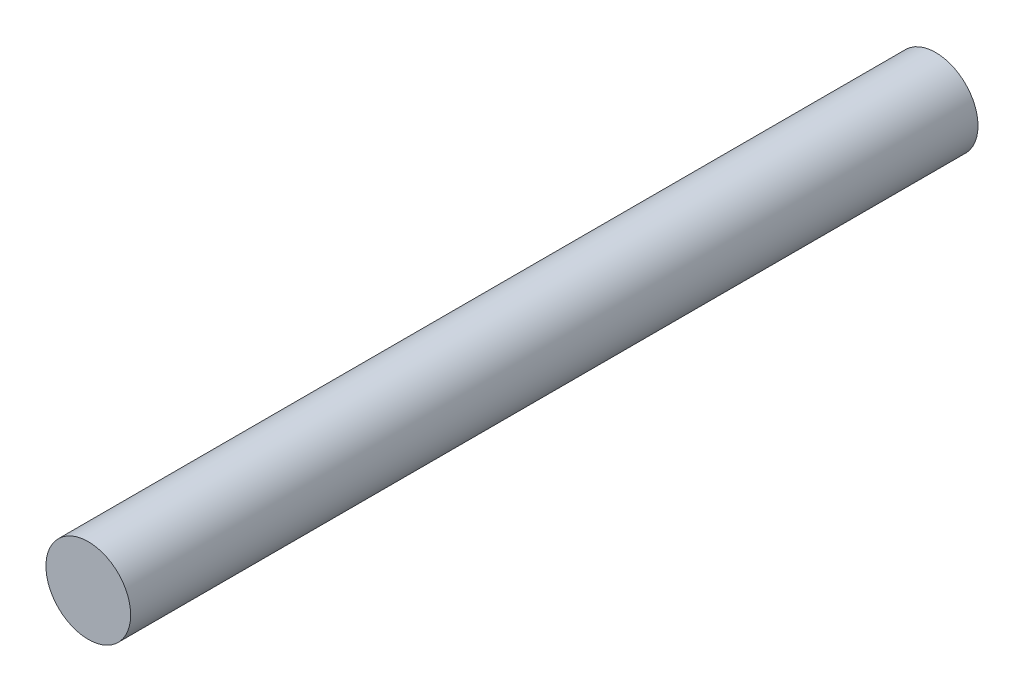
ISO-10303-21;
HEADER;
FILE_DESCRIPTION(('STEP AP214'),'2;1');
FILE_NAME('part.step','',(''),(''),'','','');
FILE_SCHEMA(('AUTOMOTIVE_DESIGN { 1 0 10303 214 1 1 1 1 }'));
ENDSEC;
DATA;
#1=APPLICATION_CONTEXT('core data for automotive mechanical design processes');
#2=APPLICATION_PROTOCOL_DEFINITION('international standard','automotive_design',2000,#1);
#3=PRODUCT_CONTEXT('',#1,'mechanical');
#4=PRODUCT('Part','Part','',(#3));
#5=PRODUCT_RELATED_PRODUCT_CATEGORY('part','',(#4));
#6=PRODUCT_DEFINITION_FORMATION('','',#4);
#7=PRODUCT_DEFINITION_CONTEXT('part definition',#1,'design');
#8=PRODUCT_DEFINITION('design','',#6,#7);
#9=PRODUCT_DEFINITION_SHAPE('','',#8);
#10=(LENGTH_UNIT() NAMED_UNIT(*) SI_UNIT(.MILLI.,.METRE.));
#11=(NAMED_UNIT(*) PLANE_ANGLE_UNIT() SI_UNIT($,.RADIAN.));
#12=(NAMED_UNIT(*) SI_UNIT($,.STERADIAN.) SOLID_ANGLE_UNIT());
#13=UNCERTAINTY_MEASURE_WITH_UNIT(LENGTH_MEASURE(1.E-05),#10,'distance_accuracy_value','');
#14=(GEOMETRIC_REPRESENTATION_CONTEXT(3) GLOBAL_UNCERTAINTY_ASSIGNED_CONTEXT((#13)) GLOBAL_UNIT_ASSIGNED_CONTEXT((#10,
#11,#12)) REPRESENTATION_CONTEXT('',''));
#15=CARTESIAN_POINT('',(0.,0.,0.));
#16=DIRECTION('',(0.,0.,1.));
#17=DIRECTION('',(1.,0.,0.));
#18=AXIS2_PLACEMENT_3D('',#15,#16,#17);
#19=CARTESIAN_POINT('',(0.,0.,25.));
#20=DIRECTION('',(0.,0.,-1.));
#21=DIRECTION('',(-1.,0.,0.));
#22=AXIS2_PLACEMENT_3D('',#19,#20,#21);
#23=CYLINDRICAL_SURFACE('',#22,1.25);
#24=CARTESIAN_POINT('',(0.,0.,25.));
#25=DIRECTION('',(0.,0.,1.));
#26=DIRECTION('',(1.,0.,0.));
#27=AXIS2_PLACEMENT_3D('',#24,#25,#26);
#28=CIRCLE('',#27,1.25);
#29=CARTESIAN_POINT('',(1.25,0.,25.));
#30=VERTEX_POINT('',#29);
#31=EDGE_CURVE('E10',#30,#30,#28,.T.);
#32=ORIENTED_EDGE('',*,*,#31,.F.);
#33=EDGE_LOOP('',(#32));
#34=FACE_BOUND('',#33,.T.);
#35=CARTESIAN_POINT('',(0.,0.,0.));
#36=DIRECTION('',(0.,0.,1.));
#37=DIRECTION('',(1.,0.,0.));
#38=AXIS2_PLACEMENT_3D('',#35,#36,#37);
#39=CIRCLE('',#38,1.25);
#40=CARTESIAN_POINT('',(1.25,0.,0.));
#41=VERTEX_POINT('',#40);
#42=EDGE_CURVE('E40',#41,#41,#39,.T.);
#43=ORIENTED_EDGE('',*,*,#42,.T.);
#44=EDGE_LOOP('',(#43));
#45=FACE_BOUND('',#44,.T.);
#46=ADVANCED_FACE('F37',(#34,#45),#23,.T.);
#47=CARTESIAN_POINT('',(0.,0.,25.));
#48=DIRECTION('',(0.,0.,1.));
#49=DIRECTION('',(1.,0.,0.));
#50=AXIS2_PLACEMENT_3D('',#47,#48,#49);
#51=PLANE('',#50);
#52=ORIENTED_EDGE('',*,*,#31,.T.);
#53=EDGE_LOOP('',(#52));
#54=FACE_BOUND('',#53,.T.);
#55=ADVANCED_FACE('F52',(#54),#51,.T.);
#56=CARTESIAN_POINT('',(0.,0.,0.));
#57=DIRECTION('',(0.,0.,1.));
#58=DIRECTION('',(1.,0.,0.));
#59=AXIS2_PLACEMENT_3D('',#56,#57,#58);
#60=PLANE('',#59);
#61=ORIENTED_EDGE('',*,*,#42,.F.);
#62=EDGE_LOOP('',(#61));
#63=FACE_BOUND('',#62,.T.);
#64=ADVANCED_FACE('F50',(#63),#60,.F.);
#65=CLOSED_SHELL('',(#46,#55,#64));
#66=MANIFOLD_SOLID_BREP('B2',#65);
#67=ADVANCED_BREP_SHAPE_REPRESENTATION('',(#18,#66),#14);
#68=SHAPE_DEFINITION_REPRESENTATION(#9,#67);
ENDSEC;
END-ISO-10303-21;
